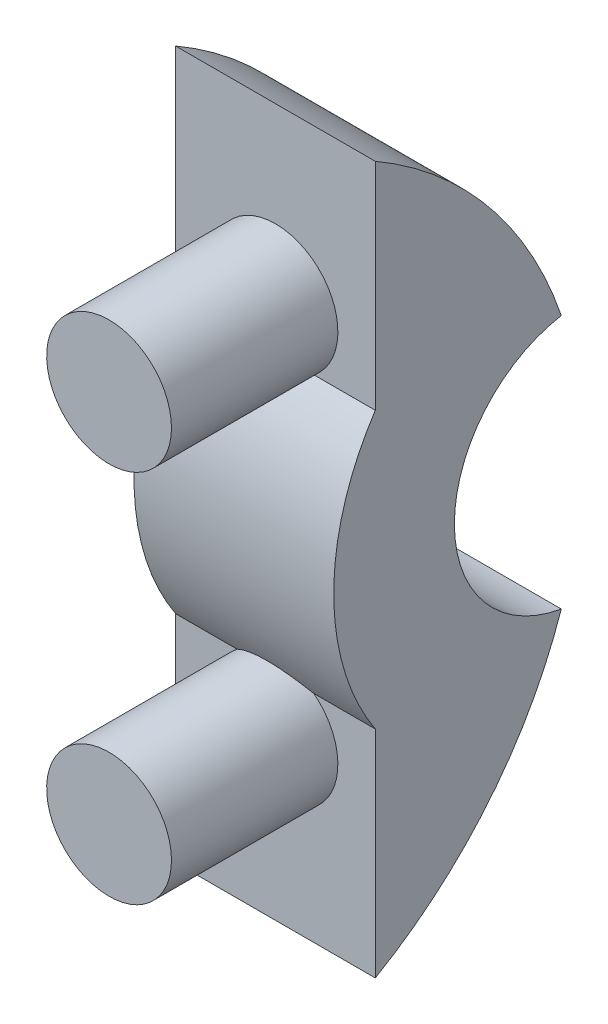
ISO-10303-21;
HEADER;
FILE_DESCRIPTION(('STEP AP214'),'2;1');
FILE_NAME('part.step','',(''),(''),'','','');
FILE_SCHEMA(('AUTOMOTIVE_DESIGN { 1 0 10303 214 1 1 1 1 }'));
ENDSEC;
DATA;
#1=APPLICATION_CONTEXT('core data for automotive mechanical design processes');
#2=APPLICATION_PROTOCOL_DEFINITION('international standard','automotive_design',2000,#1);
#3=PRODUCT_CONTEXT('',#1,'mechanical');
#4=PRODUCT('Part','Part','',(#3));
#5=PRODUCT_RELATED_PRODUCT_CATEGORY('part','',(#4));
#6=PRODUCT_DEFINITION_FORMATION('','',#4);
#7=PRODUCT_DEFINITION_CONTEXT('part definition',#1,'design');
#8=PRODUCT_DEFINITION('design','',#6,#7);
#9=PRODUCT_DEFINITION_SHAPE('','',#8);
#10=(LENGTH_UNIT() NAMED_UNIT(*) SI_UNIT(.MILLI.,.METRE.));
#11=(NAMED_UNIT(*) PLANE_ANGLE_UNIT() SI_UNIT($,.RADIAN.));
#12=(NAMED_UNIT(*) SI_UNIT($,.STERADIAN.) SOLID_ANGLE_UNIT());
#13=UNCERTAINTY_MEASURE_WITH_UNIT(LENGTH_MEASURE(1.E-05),#10,'distance_accuracy_value','');
#14=(GEOMETRIC_REPRESENTATION_CONTEXT(3) GLOBAL_UNCERTAINTY_ASSIGNED_CONTEXT((#13)) GLOBAL_UNIT_ASSIGNED_CONTEXT((#10,
#11,#12)) REPRESENTATION_CONTEXT('',''));
#15=CARTESIAN_POINT('',(0.,0.,0.));
#16=DIRECTION('',(0.,0.,1.));
#17=DIRECTION('',(1.,0.,0.));
#18=AXIS2_PLACEMENT_3D('',#15,#16,#17);
#19=CARTESIAN_POINT('',(0.,8.5,0.));
#20=DIRECTION('',(1.,0.,0.));
#21=DIRECTION('',(0.,0.,-1.));
#22=AXIS2_PLACEMENT_3D('',#19,#20,#21);
#23=CYLINDRICAL_SURFACE('',#22,6.);
#24=DIRECTION('',(1.,0.,0.));
#25=VECTOR('',#24,1.);
#26=CARTESIAN_POINT('',(0.,11.8166247903554,5.));
#27=LINE('',#26,#25);
#28=CARTESIAN_POINT('',(3.32175002750127,11.8166247903554,5.));
#29=VERTEX_POINT('',#28);
#30=CARTESIAN_POINT('',(4.8,11.8166247903554,5.));
#31=VERTEX_POINT('',#30);
#32=EDGE_CURVE('E136',#29,#31,#27,.T.);
#33=ORIENTED_EDGE('',*,*,#32,.F.);
#34=CARTESIAN_POINT('',(3.32175002750127,11.8166247903554,5.));
#35=CARTESIAN_POINT('',(3.29363869708144,11.7947273613776,5.0145255344365));
#36=CARTESIAN_POINT('',(3.2645129967345,11.7736530968872,5.02829705456855));
#37=CARTESIAN_POINT('',(3.20433260499248,11.7333658845661,5.05429705504589));
#38=CARTESIAN_POINT('',(3.1732772206306,11.7141536118073,5.06652497623618));
#39=CARTESIAN_POINT('',(3.07737604736833,11.659643036456,5.10083365659612));
#40=CARTESIAN_POINT('',(3.00981462204846,11.6274862638224,5.12052933935896));
#41=CARTESIAN_POINT('',(2.86907120745217,11.5732271425352,5.15327975521612));
#42=CARTESIAN_POINT('',(2.79587552655879,11.5511502517337,5.16631768313307));
#43=CARTESIAN_POINT('',(2.64617576857781,11.5183600019868,5.18554423966562));
#44=CARTESIAN_POINT('',(2.56967540534346,11.507634215367,5.19174035930878));
#45=CARTESIAN_POINT('',(2.41875668189845,11.4982879008999,5.19714310700455));
#46=CARTESIAN_POINT('',(2.34437607608449,11.499204154832,5.19661718909563));
#47=CARTESIAN_POINT('',(2.19685764082152,11.5119766787085,5.18922437459057));
#48=CARTESIAN_POINT('',(2.12372015597538,11.5238359333456,5.18235574802644));
#49=CARTESIAN_POINT('',(1.98166605145223,11.5576863233881,5.16245392683565));
#50=CARTESIAN_POINT('',(1.91270950208206,11.5795549646423,5.14949521233819));
#51=CARTESIAN_POINT('',(1.77985436504791,11.6323300418889,5.11756301641823));
#52=CARTESIAN_POINT('',(1.71595364450426,11.6632326406556,5.09859208843104));
#53=CARTESIAN_POINT('',(1.62395623848107,11.7158396744606,5.06545387975189));
#54=CARTESIAN_POINT('',(1.59346350099897,11.734785586723,5.05338690801304));
#55=CARTESIAN_POINT('',(1.53440729568956,11.7744346279233,5.02778624986399));
#56=CARTESIAN_POINT('',(1.5058394190708,11.795133477874,5.01425611391943));
#57=CARTESIAN_POINT('',(1.47824997249873,11.8166247903554,5.));
#58=B_SPLINE_CURVE_WITH_KNOTS('',3,(#34,#35,#36,#37,#38,#39,#40,#41,#42,#43,#44,#45,#46,#47,#48,
#49,#50,#51,#52,#53,#54,#55,#56,#57),.UNSPECIFIED.,.F.,.F.,(4,2,2,2,2,2,2,2,2,2,2,4),(0.,
0.115383839169896,0.230809355897802,0.461739332669159,0.693249365427422,0.924505668047504,
1.14659046047122,1.36873584421569,1.58823246377716,1.80763598601073,1.92115264522882,
2.03439978036435),.UNSPECIFIED.);
#59=CARTESIAN_POINT('',(1.47824997249873,11.8166247903554,5.));
#60=VERTEX_POINT('',#59);
#61=EDGE_CURVE('E11',#29,#60,#58,.T.);
#62=ORIENTED_EDGE('',*,*,#61,.T.);
#63=CARTESIAN_POINT('',(0.,11.8166247903554,5.));
#64=VERTEX_POINT('',#63);
#65=EDGE_CURVE('E140',#64,#60,#27,.T.);
#66=ORIENTED_EDGE('',*,*,#65,.F.);
#67=CARTESIAN_POINT('',(0.,8.5,0.));
#68=DIRECTION('',(1.,0.,0.));
#69=DIRECTION('',(0.,0.,-1.));
#70=AXIS2_PLACEMENT_3D('',#67,#68,#69);
#71=CIRCLE('',#70,6.);
#72=CARTESIAN_POINT('',(0.,5.1833752096446,5.));
#73=VERTEX_POINT('',#72);
#74=EDGE_CURVE('E134',#64,#73,#71,.T.);
#75=ORIENTED_EDGE('',*,*,#74,.T.);
#76=DIRECTION('',(1.,0.,0.));
#77=VECTOR('',#76,1.);
#78=CARTESIAN_POINT('',(0.,5.1833752096446,5.));
#79=LINE('',#78,#77);
#80=CARTESIAN_POINT('',(1.47824997249873,5.1833752096446,5.));
#81=VERTEX_POINT('',#80);
#82=EDGE_CURVE('E123',#73,#81,#79,.T.);
#83=ORIENTED_EDGE('',*,*,#82,.T.);
#84=CARTESIAN_POINT('',(1.47824997249873,5.1833752096446,5.));
#85=CARTESIAN_POINT('',(1.50636130291856,5.20527263862244,5.0145255344365));
#86=CARTESIAN_POINT('',(1.5354870032655,5.22634690311282,5.02829705456855));
#87=CARTESIAN_POINT('',(1.59566739500752,5.26663411543392,5.05429705504589));
#88=CARTESIAN_POINT('',(1.6267227793694,5.2858463881927,5.06652497623619));
#89=CARTESIAN_POINT('',(1.72262395263167,5.34035696354404,5.10083365659612));
#90=CARTESIAN_POINT('',(1.79018537795154,5.37251373617756,5.12052933935896));
#91=CARTESIAN_POINT('',(1.93092879254783,5.42677285746483,5.15327975521613));
#92=CARTESIAN_POINT('',(2.00412447344121,5.4488497482663,5.16631768313307));
#93=CARTESIAN_POINT('',(2.15382423142219,5.48163999801319,5.18554423966562));
#94=CARTESIAN_POINT('',(2.23032459465654,5.492365784633,5.19174035930878));
#95=CARTESIAN_POINT('',(2.38124331810155,5.50171209910011,5.19714310700455));
#96=CARTESIAN_POINT('',(2.45562392391551,5.50079584516796,5.19661718909563));
#97=CARTESIAN_POINT('',(2.60314235917848,5.48802332129147,5.18922437459057));
#98=CARTESIAN_POINT('',(2.67627984402462,5.47616406665438,5.18235574802644));
#99=CARTESIAN_POINT('',(2.81833394854777,5.44231367661192,5.16245392683565));
#100=CARTESIAN_POINT('',(2.88729049791794,5.42044503535767,5.1494952123382));
#101=CARTESIAN_POINT('',(3.02014563495209,5.36766995811112,5.11756301641823));
#102=CARTESIAN_POINT('',(3.08404635549574,5.33676735934445,5.09859208843104));
#103=CARTESIAN_POINT('',(3.17604376151893,5.28416032553935,5.06545387975189));
#104=CARTESIAN_POINT('',(3.20653649900103,5.26521441327703,5.05338690801304));
#105=CARTESIAN_POINT('',(3.26559270431044,5.22556537207666,5.027786249864));
#106=CARTESIAN_POINT('',(3.2941605809292,5.20486652212603,5.01425611391944));
#107=CARTESIAN_POINT('',(3.32175002750127,5.1833752096446,5.));
#108=B_SPLINE_CURVE_WITH_KNOTS('',3,(#84,#85,#86,#87,#88,#89,#90,#91,#92,#93,#94,#95,#96,#97,
#98,#99,#100,#101,#102,#103,#104,#105,#106,#107),.UNSPECIFIED.,.F.,.F.,(4,2,2,2,2,2,2,2,2,2,2,
4),(0.,0.115383839169897,0.230809355897803,0.461739332669159,0.69324936542742,0.924505668047503,
1.14659046047122,1.36873584421569,1.58823246377716,1.80763598601073,1.92115264522882,
2.03439978036435),.UNSPECIFIED.);
#109=CARTESIAN_POINT('',(3.32175002750127,5.1833752096446,5.));
#110=VERTEX_POINT('',#109);
#111=EDGE_CURVE('E60',#81,#110,#108,.T.);
#112=ORIENTED_EDGE('',*,*,#111,.T.);
#113=CARTESIAN_POINT('',(4.8,5.1833752096446,5.));
#114=VERTEX_POINT('',#113);
#115=EDGE_CURVE('E126',#110,#114,#79,.T.);
#116=ORIENTED_EDGE('',*,*,#115,.T.);
#117=CARTESIAN_POINT('',(4.8,8.5,0.));
#118=DIRECTION('',(1.,0.,0.));
#119=DIRECTION('',(0.,0.,-1.));
#120=AXIS2_PLACEMENT_3D('',#117,#118,#119);
#121=CIRCLE('',#120,6.);
#122=EDGE_CURVE('E247',#31,#114,#121,.T.);
#123=ORIENTED_EDGE('',*,*,#122,.F.);
#124=EDGE_LOOP('',(#33,#62,#66,#75,#83,#112,#116,#123));
#125=FACE_BOUND('',#124,.T.);
#126=ADVANCED_FACE('F45',(#125),#23,.T.);
#127=CARTESIAN_POINT('',(0.,0.,5.));
#128=DIRECTION('',(0.,0.,-1.));
#129=DIRECTION('',(-1.,0.,0.));
#130=AXIS2_PLACEMENT_3D('',#127,#128,#129);
#131=PLANE('',#130);
#132=CARTESIAN_POINT('',(2.4,13.,5.));
#133=DIRECTION('',(0.,0.,1.));
#134=DIRECTION('',(1.,0.,0.));
#135=AXIS2_PLACEMENT_3D('',#132,#133,#134);
#136=CIRCLE('',#135,1.5);
#137=EDGE_CURVE('E73',#29,#60,#136,.T.);
#138=ORIENTED_EDGE('',*,*,#137,.F.);
#139=ORIENTED_EDGE('',*,*,#32,.T.);
#140=DIRECTION('',(0.,1.,0.));
#141=VECTOR('',#140,1.);
#142=CARTESIAN_POINT('',(4.8,0.,5.));
#143=LINE('',#142,#141);
#144=CARTESIAN_POINT('',(4.8,17.,5.));
#145=VERTEX_POINT('',#144);
#146=EDGE_CURVE('E160',#31,#145,#143,.T.);
#147=ORIENTED_EDGE('',*,*,#146,.T.);
#148=DIRECTION('',(-1.,0.,0.));
#149=VECTOR('',#148,1.);
#150=CARTESIAN_POINT('',(0.,17.,5.));
#151=LINE('',#150,#149);
#152=CARTESIAN_POINT('',(0.,17.,5.));
#153=VERTEX_POINT('',#152);
#154=EDGE_CURVE('E164',#145,#153,#151,.T.);
#155=ORIENTED_EDGE('',*,*,#154,.T.);
#156=DIRECTION('',(0.,-1.,0.));
#157=VECTOR('',#156,1.);
#158=CARTESIAN_POINT('',(0.,0.,5.));
#159=LINE('',#158,#157);
#160=EDGE_CURVE('E153',#153,#64,#159,.T.);
#161=ORIENTED_EDGE('',*,*,#160,.T.);
#162=ORIENTED_EDGE('',*,*,#65,.T.);
#163=EDGE_LOOP('',(#138,#139,#147,#155,#161,#162));
#164=FACE_BOUND('',#163,.T.);
#165=ADVANCED_FACE('F206',(#164),#131,.F.);
#166=CARTESIAN_POINT('',(0.,0.,5.));
#167=DIRECTION('',(1.,0.,0.));
#168=DIRECTION('',(0.,0.,-1.));
#169=AXIS2_PLACEMENT_3D('',#166,#167,#168);
#170=PLANE('',#169);
#171=CARTESIAN_POINT('',(0.,8.5,0.));
#172=DIRECTION('',(1.,0.,0.));
#173=DIRECTION('',(0.,0.,-1.));
#174=AXIS2_PLACEMENT_3D('',#171,#172,#173);
#175=CIRCLE('',#174,3.1);
#176=CARTESIAN_POINT('',(0.,11.554230894319,0.53072935116464));
#177=VERTEX_POINT('',#176);
#178=CARTESIAN_POINT('',(0.,5.44576910568105,0.53072935116464));
#179=VERTEX_POINT('',#178);
#180=EDGE_CURVE('E144',#177,#179,#175,.T.);
#181=ORIENTED_EDGE('',*,*,#180,.T.);
#182=CARTESIAN_POINT('',(0.,8.66025403784439,10.));
#183=DIRECTION('',(1.,0.,0.));
#184=DIRECTION('',(0.,0.,-1.));
#185=AXIS2_PLACEMENT_3D('',#182,#183,#184);
#186=CIRCLE('',#185,10.);
#187=CARTESIAN_POINT('',(0.,0.,5.));
#188=VERTEX_POINT('',#187);
#189=EDGE_CURVE('E119',#179,#188,#186,.F.);
#190=ORIENTED_EDGE('',*,*,#189,.T.);
#191=EDGE_CURVE('E148',#73,#188,#159,.T.);
#192=ORIENTED_EDGE('',*,*,#191,.F.);
#193=ORIENTED_EDGE('',*,*,#74,.F.);
#194=ORIENTED_EDGE('',*,*,#160,.F.);
#195=CARTESIAN_POINT('',(0.,8.33974596215561,10.));
#196=DIRECTION('',(1.,0.,0.));
#197=DIRECTION('',(0.,0.,-1.));
#198=AXIS2_PLACEMENT_3D('',#195,#196,#197);
#199=CIRCLE('',#198,10.);
#200=EDGE_CURVE('E180',#153,#177,#199,.F.);
#201=ORIENTED_EDGE('',*,*,#200,.T.);
#202=EDGE_LOOP('',(#181,#190,#192,#193,#194,#201));
#203=FACE_BOUND('',#202,.T.);
#204=ADVANCED_FACE('F211',(#203),#170,.F.);
#205=CARTESIAN_POINT('',(4.8,0.,5.));
#206=DIRECTION('',(-1.,0.,0.));
#207=DIRECTION('',(0.,0.,1.));
#208=AXIS2_PLACEMENT_3D('',#205,#206,#207);
#209=PLANE('',#208);
#210=CARTESIAN_POINT('',(4.8,0.,5.));
#211=VERTEX_POINT('',#210);
#212=EDGE_CURVE('E161',#211,#114,#143,.T.);
#213=ORIENTED_EDGE('',*,*,#212,.F.);
#214=CARTESIAN_POINT('',(4.8,8.66025403784439,10.));
#215=DIRECTION('',(-1.,0.,0.));
#216=DIRECTION('',(0.,0.,1.));
#217=AXIS2_PLACEMENT_3D('',#214,#215,#216);
#218=CIRCLE('',#217,10.);
#219=CARTESIAN_POINT('',(4.8,5.44576910568105,0.53072935116464));
#220=VERTEX_POINT('',#219);
#221=EDGE_CURVE('E171',#211,#220,#218,.F.);
#222=ORIENTED_EDGE('',*,*,#221,.T.);
#223=CARTESIAN_POINT('',(4.8,8.5,0.));
#224=DIRECTION('',(1.,0.,0.));
#225=DIRECTION('',(0.,0.,-1.));
#226=AXIS2_PLACEMENT_3D('',#223,#224,#225);
#227=CIRCLE('',#226,3.1);
#228=CARTESIAN_POINT('',(4.8,11.554230894319,0.53072935116464));
#229=VERTEX_POINT('',#228);
#230=EDGE_CURVE('E149',#229,#220,#227,.T.);
#231=ORIENTED_EDGE('',*,*,#230,.F.);
#232=CARTESIAN_POINT('',(4.8,8.33974596215561,10.));
#233=DIRECTION('',(-1.,0.,0.));
#234=DIRECTION('',(0.,0.,1.));
#235=AXIS2_PLACEMENT_3D('',#232,#233,#234);
#236=CIRCLE('',#235,10.);
#237=EDGE_CURVE('E168',#229,#145,#236,.F.);
#238=ORIENTED_EDGE('',*,*,#237,.T.);
#239=ORIENTED_EDGE('',*,*,#146,.F.);
#240=ORIENTED_EDGE('',*,*,#122,.T.);
#241=EDGE_LOOP('',(#213,#222,#231,#238,#239,#240));
#242=FACE_BOUND('',#241,.T.);
#243=ADVANCED_FACE('F218',(#242),#209,.F.);
#244=CARTESIAN_POINT('',(2.4,4.,5.));
#245=DIRECTION('',(0.,0.,1.));
#246=DIRECTION('',(1.,0.,0.));
#247=AXIS2_PLACEMENT_3D('',#244,#245,#246);
#248=CIRCLE('',#247,1.5);
#249=EDGE_CURVE('E66',#81,#110,#248,.T.);
#250=ORIENTED_EDGE('',*,*,#249,.F.);
#251=ORIENTED_EDGE('',*,*,#82,.F.);
#252=ORIENTED_EDGE('',*,*,#191,.T.);
#253=DIRECTION('',(1.,0.,0.));
#254=VECTOR('',#253,1.);
#255=CARTESIAN_POINT('',(0.,0.,5.));
#256=LINE('',#255,#254);
#257=EDGE_CURVE('E156',#188,#211,#256,.T.);
#258=ORIENTED_EDGE('',*,*,#257,.T.);
#259=ORIENTED_EDGE('',*,*,#212,.T.);
#260=ORIENTED_EDGE('',*,*,#115,.F.);
#261=EDGE_LOOP('',(#250,#251,#252,#258,#259,#260));
#262=FACE_BOUND('',#261,.T.);
#263=ADVANCED_FACE('F121',(#262),#131,.F.);
#264=CARTESIAN_POINT('',(0.,8.5,0.));
#265=DIRECTION('',(1.,0.,0.));
#266=DIRECTION('',(0.,0.,-1.));
#267=AXIS2_PLACEMENT_3D('',#264,#265,#266);
#268=CYLINDRICAL_SURFACE('',#267,3.1);
#269=ORIENTED_EDGE('',*,*,#230,.T.);
#270=DIRECTION('',(1.,0.,0.));
#271=VECTOR('',#270,1.);
#272=CARTESIAN_POINT('',(2.4,5.44576910568105,0.53072935116464));
#273=LINE('',#272,#271);
#274=EDGE_CURVE('E177',#220,#179,#273,.F.);
#275=ORIENTED_EDGE('',*,*,#274,.T.);
#276=ORIENTED_EDGE('',*,*,#180,.F.);
#277=DIRECTION('',(1.,0.,0.));
#278=VECTOR('',#277,1.);
#279=CARTESIAN_POINT('',(2.4,11.554230894319,0.53072935116464));
#280=LINE('',#279,#278);
#281=EDGE_CURVE('E174',#177,#229,#280,.T.);
#282=ORIENTED_EDGE('',*,*,#281,.T.);
#283=EDGE_LOOP('',(#269,#275,#276,#282));
#284=FACE_BOUND('',#283,.T.);
#285=ADVANCED_FACE('F222',(#284),#268,.F.);
#286=CARTESIAN_POINT('',(0.,8.66025403784439,10.));
#287=DIRECTION('',(-1.,0.,0.));
#288=DIRECTION('',(0.,0.,1.));
#289=AXIS2_PLACEMENT_3D('',#286,#287,#288);
#290=CYLINDRICAL_SURFACE('',#289,10.);
#291=ORIENTED_EDGE('',*,*,#189,.F.);
#292=ORIENTED_EDGE('',*,*,#274,.F.);
#293=ORIENTED_EDGE('',*,*,#221,.F.);
#294=ORIENTED_EDGE('',*,*,#257,.F.);
#295=EDGE_LOOP('',(#291,#292,#293,#294));
#296=FACE_BOUND('',#295,.T.);
#297=ADVANCED_FACE('F226',(#296),#290,.T.);
#298=CARTESIAN_POINT('',(0.,8.33974596215561,10.));
#299=DIRECTION('',(1.,0.,0.));
#300=DIRECTION('',(0.,0.,-1.));
#301=AXIS2_PLACEMENT_3D('',#298,#299,#300);
#302=CYLINDRICAL_SURFACE('',#301,10.);
#303=ORIENTED_EDGE('',*,*,#237,.F.);
#304=ORIENTED_EDGE('',*,*,#281,.F.);
#305=ORIENTED_EDGE('',*,*,#200,.F.);
#306=ORIENTED_EDGE('',*,*,#154,.F.);
#307=EDGE_LOOP('',(#303,#304,#305,#306));
#308=FACE_BOUND('',#307,.T.);
#309=ADVANCED_FACE('F47',(#308),#302,.T.);
#310=CARTESIAN_POINT('',(2.4,4.,9.));
#311=DIRECTION('',(0.,0.,-1.));
#312=DIRECTION('',(-1.,0.,0.));
#313=AXIS2_PLACEMENT_3D('',#310,#311,#312);
#314=CYLINDRICAL_SURFACE('',#313,1.5);
#315=ORIENTED_EDGE('',*,*,#111,.F.);
#316=ORIENTED_EDGE('',*,*,#249,.T.);
#317=EDGE_LOOP('',(#315,#316));
#318=FACE_BOUND('',#317,.T.);
#319=CARTESIAN_POINT('',(2.4,4.,9.));
#320=DIRECTION('',(0.,0.,1.));
#321=DIRECTION('',(1.,0.,0.));
#322=AXIS2_PLACEMENT_3D('',#319,#320,#321);
#323=CIRCLE('',#322,1.5);
#324=CARTESIAN_POINT('',(3.9,4.,9.));
#325=VERTEX_POINT('',#324);
#326=EDGE_CURVE('E128',#325,#325,#323,.T.);
#327=ORIENTED_EDGE('',*,*,#326,.F.);
#328=EDGE_LOOP('',(#327));
#329=FACE_BOUND('',#328,.T.);
#330=ADVANCED_FACE('F113',(#318,#329),#314,.T.);
#331=CARTESIAN_POINT('',(2.4,4.,9.));
#332=DIRECTION('',(0.,0.,1.));
#333=DIRECTION('',(1.,0.,0.));
#334=AXIS2_PLACEMENT_3D('',#331,#332,#333);
#335=PLANE('',#334);
#336=ORIENTED_EDGE('',*,*,#326,.T.);
#337=EDGE_LOOP('',(#336));
#338=FACE_BOUND('',#337,.T.);
#339=ADVANCED_FACE('F194',(#338),#335,.T.);
#340=CARTESIAN_POINT('',(2.4,13.,9.));
#341=DIRECTION('',(0.,0.,-1.));
#342=DIRECTION('',(-1.,0.,0.));
#343=AXIS2_PLACEMENT_3D('',#340,#341,#342);
#344=CYLINDRICAL_SURFACE('',#343,1.5);
#345=ORIENTED_EDGE('',*,*,#61,.F.);
#346=ORIENTED_EDGE('',*,*,#137,.T.);
#347=EDGE_LOOP('',(#345,#346));
#348=FACE_BOUND('',#347,.T.);
#349=CARTESIAN_POINT('',(2.4,13.,9.));
#350=DIRECTION('',(0.,0.,1.));
#351=DIRECTION('',(1.,0.,0.));
#352=AXIS2_PLACEMENT_3D('',#349,#350,#351);
#353=CIRCLE('',#352,1.5);
#354=CARTESIAN_POINT('',(3.9,13.,9.));
#355=VERTEX_POINT('',#354);
#356=EDGE_CURVE('E251',#355,#355,#353,.T.);
#357=ORIENTED_EDGE('',*,*,#356,.F.);
#358=EDGE_LOOP('',(#357));
#359=FACE_BOUND('',#358,.T.);
#360=ADVANCED_FACE('F195',(#348,#359),#344,.T.);
#361=CARTESIAN_POINT('',(2.4,13.,9.));
#362=DIRECTION('',(0.,0.,1.));
#363=DIRECTION('',(1.,0.,0.));
#364=AXIS2_PLACEMENT_3D('',#361,#362,#363);
#365=PLANE('',#364);
#366=ORIENTED_EDGE('',*,*,#356,.T.);
#367=EDGE_LOOP('',(#366));
#368=FACE_BOUND('',#367,.T.);
#369=ADVANCED_FACE('F203',(#368),#365,.T.);
#370=CLOSED_SHELL('',(#126,#165,#204,#243,#263,#285,#297,#309,#330,#339,#360,#369));
#371=MANIFOLD_SOLID_BREP('B2',#370);
#372=ADVANCED_BREP_SHAPE_REPRESENTATION('',(#18,#371),#14);
#373=SHAPE_DEFINITION_REPRESENTATION(#9,#372);
ENDSEC;
END-ISO-10303-21;
